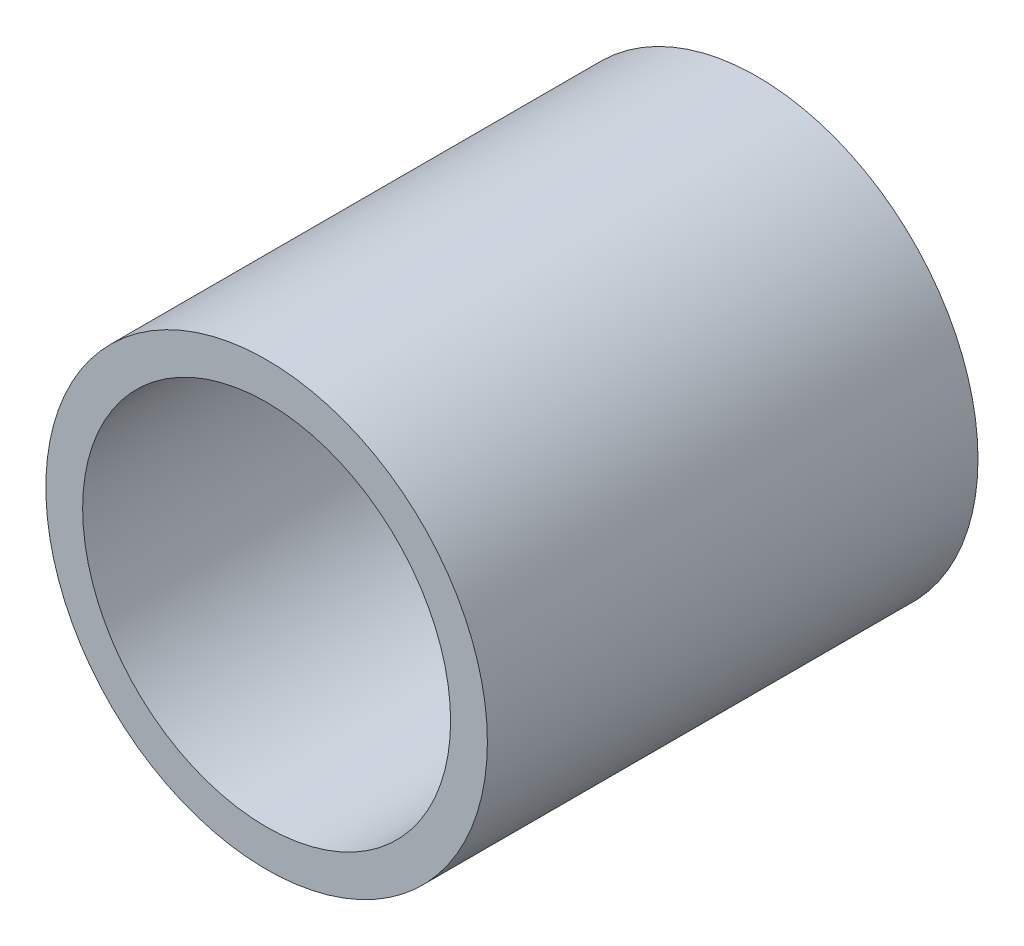
ISO-10303-21;
HEADER;
FILE_DESCRIPTION(('STEP AP214'),'2;1');
FILE_NAME('part.step','',(''),(''),'','','');
FILE_SCHEMA(('AUTOMOTIVE_DESIGN { 1 0 10303 214 1 1 1 1 }'));
ENDSEC;
DATA;
#1=APPLICATION_CONTEXT('core data for automotive mechanical design processes');
#2=APPLICATION_PROTOCOL_DEFINITION('international standard','automotive_design',2000,#1);
#3=PRODUCT_CONTEXT('',#1,'mechanical');
#4=PRODUCT('Part','Part','',(#3));
#5=PRODUCT_RELATED_PRODUCT_CATEGORY('part','',(#4));
#6=PRODUCT_DEFINITION_FORMATION('','',#4);
#7=PRODUCT_DEFINITION_CONTEXT('part definition',#1,'design');
#8=PRODUCT_DEFINITION('design','',#6,#7);
#9=PRODUCT_DEFINITION_SHAPE('','',#8);
#10=(LENGTH_UNIT() NAMED_UNIT(*) SI_UNIT(.MILLI.,.METRE.));
#11=(NAMED_UNIT(*) PLANE_ANGLE_UNIT() SI_UNIT($,.RADIAN.));
#12=(NAMED_UNIT(*) SI_UNIT($,.STERADIAN.) SOLID_ANGLE_UNIT());
#13=UNCERTAINTY_MEASURE_WITH_UNIT(LENGTH_MEASURE(1.E-05),#10,'distance_accuracy_value','');
#14=(GEOMETRIC_REPRESENTATION_CONTEXT(3) GLOBAL_UNCERTAINTY_ASSIGNED_CONTEXT((#13)) GLOBAL_UNIT_ASSIGNED_CONTEXT((#10,
#11,#12)) REPRESENTATION_CONTEXT('',''));
#15=CARTESIAN_POINT('',(0.,0.,0.));
#16=DIRECTION('',(0.,0.,1.));
#17=DIRECTION('',(1.,0.,0.));
#18=AXIS2_PLACEMENT_3D('',#15,#16,#17);
#19=CARTESIAN_POINT('',(0.,0.,120.));
#20=DIRECTION('',(0.,0.,1.));
#21=DIRECTION('',(1.,0.,0.));
#22=AXIS2_PLACEMENT_3D('',#19,#20,#21);
#23=PLANE('',#22);
#24=CARTESIAN_POINT('',(0.,0.,120.));
#25=DIRECTION('',(0.,0.,1.));
#26=DIRECTION('',(1.,0.,0.));
#27=AXIS2_PLACEMENT_3D('',#24,#25,#26);
#28=CIRCLE('',#27,54.);
#29=CARTESIAN_POINT('',(54.,0.,120.));
#30=VERTEX_POINT('',#29);
#31=EDGE_CURVE('E10',#30,#30,#28,.T.);
#32=ORIENTED_EDGE('',*,*,#31,.T.);
#33=EDGE_LOOP('',(#32));
#34=FACE_BOUND('',#33,.T.);
#35=CARTESIAN_POINT('',(0.,0.,120.));
#36=DIRECTION('',(0.,0.,1.));
#37=DIRECTION('',(1.,0.,0.));
#38=AXIS2_PLACEMENT_3D('',#35,#36,#37);
#39=CIRCLE('',#38,45.);
#40=CARTESIAN_POINT('',(45.,0.,120.));
#41=VERTEX_POINT('',#40);
#42=EDGE_CURVE('E48',#41,#41,#39,.T.);
#43=ORIENTED_EDGE('',*,*,#42,.F.);
#44=EDGE_LOOP('',(#43));
#45=FACE_BOUND('',#44,.T.);
#46=ADVANCED_FACE('F37',(#34,#45),#23,.T.);
#47=CARTESIAN_POINT('',(0.,0.,0.));
#48=DIRECTION('',(0.,0.,1.));
#49=DIRECTION('',(1.,0.,0.));
#50=AXIS2_PLACEMENT_3D('',#47,#48,#49);
#51=PLANE('',#50);
#52=CARTESIAN_POINT('',(0.,0.,0.));
#53=DIRECTION('',(0.,0.,1.));
#54=DIRECTION('',(1.,0.,0.));
#55=AXIS2_PLACEMENT_3D('',#52,#53,#54);
#56=CIRCLE('',#55,54.);
#57=CARTESIAN_POINT('',(54.,0.,0.));
#58=VERTEX_POINT('',#57);
#59=EDGE_CURVE('E41',#58,#58,#56,.T.);
#60=ORIENTED_EDGE('',*,*,#59,.F.);
#61=EDGE_LOOP('',(#60));
#62=FACE_BOUND('',#61,.T.);
#63=CARTESIAN_POINT('',(0.,0.,0.));
#64=DIRECTION('',(0.,0.,1.));
#65=DIRECTION('',(1.,0.,0.));
#66=AXIS2_PLACEMENT_3D('',#63,#64,#65);
#67=CIRCLE('',#66,45.);
#68=CARTESIAN_POINT('',(45.,0.,0.));
#69=VERTEX_POINT('',#68);
#70=EDGE_CURVE('E50',#69,#69,#67,.T.);
#71=ORIENTED_EDGE('',*,*,#70,.T.);
#72=EDGE_LOOP('',(#71));
#73=FACE_BOUND('',#72,.T.);
#74=ADVANCED_FACE('F60',(#62,#73),#51,.F.);
#75=CARTESIAN_POINT('',(0.,0.,120.));
#76=DIRECTION('',(0.,0.,-1.));
#77=DIRECTION('',(-1.,0.,0.));
#78=AXIS2_PLACEMENT_3D('',#75,#76,#77);
#79=CYLINDRICAL_SURFACE('',#78,54.);
#80=ORIENTED_EDGE('',*,*,#31,.F.);
#81=EDGE_LOOP('',(#80));
#82=FACE_BOUND('',#81,.T.);
#83=ORIENTED_EDGE('',*,*,#59,.T.);
#84=EDGE_LOOP('',(#83));
#85=FACE_BOUND('',#84,.T.);
#86=ADVANCED_FACE('F39',(#82,#85),#79,.T.);
#87=CARTESIAN_POINT('',(0.,0.,120.));
#88=DIRECTION('',(0.,0.,-1.));
#89=DIRECTION('',(-1.,0.,0.));
#90=AXIS2_PLACEMENT_3D('',#87,#88,#89);
#91=CYLINDRICAL_SURFACE('',#90,45.);
#92=ORIENTED_EDGE('',*,*,#42,.T.);
#93=EDGE_LOOP('',(#92));
#94=FACE_BOUND('',#93,.T.);
#95=ORIENTED_EDGE('',*,*,#70,.F.);
#96=EDGE_LOOP('',(#95));
#97=FACE_BOUND('',#96,.T.);
#98=ADVANCED_FACE('F56',(#94,#97),#91,.F.);
#99=CLOSED_SHELL('',(#46,#74,#86,#98));
#100=MANIFOLD_SOLID_BREP('B2',#99);
#101=ADVANCED_BREP_SHAPE_REPRESENTATION('',(#18,#100),#14);
#102=SHAPE_DEFINITION_REPRESENTATION(#9,#101);
ENDSEC;
END-ISO-10303-21;
